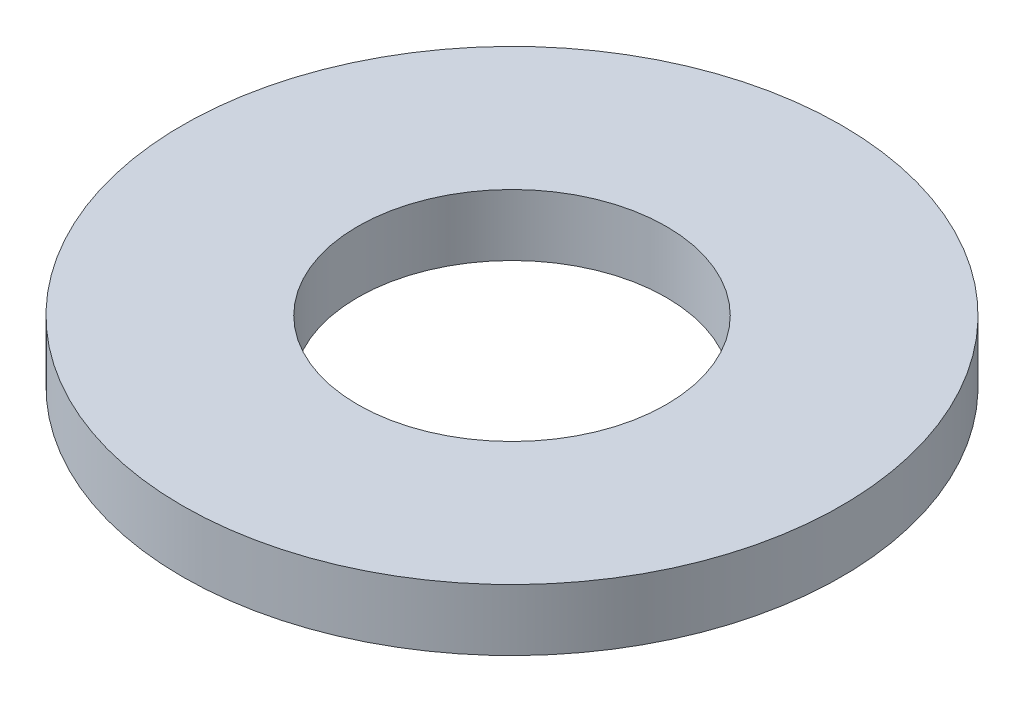
ISO-10303-21;
HEADER;
FILE_DESCRIPTION(('STEP AP214'),'2;1');
FILE_NAME('part.step','',(''),(''),'','','');
FILE_SCHEMA(('AUTOMOTIVE_DESIGN { 1 0 10303 214 1 1 1 1 }'));
ENDSEC;
DATA;
#1=APPLICATION_CONTEXT('core data for automotive mechanical design processes');
#2=APPLICATION_PROTOCOL_DEFINITION('international standard','automotive_design',2000,#1);
#3=PRODUCT_CONTEXT('',#1,'mechanical');
#4=PRODUCT('Part','Part','',(#3));
#5=PRODUCT_RELATED_PRODUCT_CATEGORY('part','',(#4));
#6=PRODUCT_DEFINITION_FORMATION('','',#4);
#7=PRODUCT_DEFINITION_CONTEXT('part definition',#1,'design');
#8=PRODUCT_DEFINITION('design','',#6,#7);
#9=PRODUCT_DEFINITION_SHAPE('','',#8);
#10=(LENGTH_UNIT() NAMED_UNIT(*) SI_UNIT(.MILLI.,.METRE.));
#11=(NAMED_UNIT(*) PLANE_ANGLE_UNIT() SI_UNIT($,.RADIAN.));
#12=(NAMED_UNIT(*) SI_UNIT($,.STERADIAN.) SOLID_ANGLE_UNIT());
#13=UNCERTAINTY_MEASURE_WITH_UNIT(LENGTH_MEASURE(1.E-05),#10,'distance_accuracy_value','');
#14=(GEOMETRIC_REPRESENTATION_CONTEXT(3) GLOBAL_UNCERTAINTY_ASSIGNED_CONTEXT((#13)) GLOBAL_UNIT_ASSIGNED_CONTEXT((#10,
#11,#12)) REPRESENTATION_CONTEXT('',''));
#15=CARTESIAN_POINT('',(0.,0.,0.));
#16=DIRECTION('',(0.,0.,1.));
#17=DIRECTION('',(1.,0.,0.));
#18=AXIS2_PLACEMENT_3D('',#15,#16,#17);
#19=CARTESIAN_POINT('',(0.,1.4224,0.));
#20=DIRECTION('',(0.,1.,0.));
#21=DIRECTION('',(0.,0.,1.));
#22=AXIS2_PLACEMENT_3D('',#19,#20,#21);
#23=PLANE('',#22);
#24=CARTESIAN_POINT('',(0.,1.4224,0.));
#25=DIRECTION('',(0.,1.,0.));
#26=DIRECTION('',(0.,0.,1.));
#27=AXIS2_PLACEMENT_3D('',#24,#25,#26);
#28=CIRCLE('',#27,7.62);
#29=CARTESIAN_POINT('',(0.,1.4224,7.62));
#30=VERTEX_POINT('',#29);
#31=EDGE_CURVE('E10',#30,#30,#28,.T.);
#32=ORIENTED_EDGE('',*,*,#31,.T.);
#33=EDGE_LOOP('',(#32));
#34=FACE_BOUND('',#33,.T.);
#35=CARTESIAN_POINT('',(0.,1.4224,0.));
#36=DIRECTION('',(0.,1.,0.));
#37=DIRECTION('',(0.,0.,1.));
#38=AXIS2_PLACEMENT_3D('',#35,#36,#37);
#39=CIRCLE('',#38,3.5687);
#40=CARTESIAN_POINT('',(0.,1.4224,3.5687));
#41=VERTEX_POINT('',#40);
#42=EDGE_CURVE('E42',#41,#41,#39,.T.);
#43=ORIENTED_EDGE('',*,*,#42,.F.);
#44=EDGE_LOOP('',(#43));
#45=FACE_BOUND('',#44,.T.);
#46=ADVANCED_FACE('F31',(#34,#45),#23,.T.);
#47=CARTESIAN_POINT('',(0.,0.,0.));
#48=DIRECTION('',(0.,1.,0.));
#49=DIRECTION('',(0.,0.,1.));
#50=AXIS2_PLACEMENT_3D('',#47,#48,#49);
#51=PLANE('',#50);
#52=CARTESIAN_POINT('',(0.,0.,0.));
#53=DIRECTION('',(0.,1.,0.));
#54=DIRECTION('',(0.,0.,1.));
#55=AXIS2_PLACEMENT_3D('',#52,#53,#54);
#56=CIRCLE('',#55,7.62);
#57=CARTESIAN_POINT('',(0.,0.,7.62));
#58=VERTEX_POINT('',#57);
#59=EDGE_CURVE('E35',#58,#58,#56,.T.);
#60=ORIENTED_EDGE('',*,*,#59,.F.);
#61=EDGE_LOOP('',(#60));
#62=FACE_BOUND('',#61,.T.);
#63=CARTESIAN_POINT('',(0.,0.,0.));
#64=DIRECTION('',(0.,1.,0.));
#65=DIRECTION('',(0.,0.,1.));
#66=AXIS2_PLACEMENT_3D('',#63,#64,#65);
#67=CIRCLE('',#66,3.5687);
#68=CARTESIAN_POINT('',(0.,0.,3.5687));
#69=VERTEX_POINT('',#68);
#70=EDGE_CURVE('E44',#69,#69,#67,.T.);
#71=ORIENTED_EDGE('',*,*,#70,.T.);
#72=EDGE_LOOP('',(#71));
#73=FACE_BOUND('',#72,.T.);
#74=ADVANCED_FACE('F54',(#62,#73),#51,.F.);
#75=CARTESIAN_POINT('',(0.,1.4224,0.));
#76=DIRECTION('',(0.,-1.,0.));
#77=DIRECTION('',(0.,0.,-1.));
#78=AXIS2_PLACEMENT_3D('',#75,#76,#77);
#79=CYLINDRICAL_SURFACE('',#78,7.62);
#80=ORIENTED_EDGE('',*,*,#31,.F.);
#81=EDGE_LOOP('',(#80));
#82=FACE_BOUND('',#81,.T.);
#83=ORIENTED_EDGE('',*,*,#59,.T.);
#84=EDGE_LOOP('',(#83));
#85=FACE_BOUND('',#84,.T.);
#86=ADVANCED_FACE('F33',(#82,#85),#79,.T.);
#87=CARTESIAN_POINT('',(0.,1.4224,0.));
#88=DIRECTION('',(0.,-1.,0.));
#89=DIRECTION('',(0.,0.,-1.));
#90=AXIS2_PLACEMENT_3D('',#87,#88,#89);
#91=CYLINDRICAL_SURFACE('',#90,3.5687);
#92=ORIENTED_EDGE('',*,*,#42,.T.);
#93=EDGE_LOOP('',(#92));
#94=FACE_BOUND('',#93,.T.);
#95=ORIENTED_EDGE('',*,*,#70,.F.);
#96=EDGE_LOOP('',(#95));
#97=FACE_BOUND('',#96,.T.);
#98=ADVANCED_FACE('F50',(#94,#97),#91,.F.);
#99=CLOSED_SHELL('',(#46,#74,#86,#98));
#100=MANIFOLD_SOLID_BREP('B2',#99);
#101=ADVANCED_BREP_SHAPE_REPRESENTATION('',(#18,#100),#14);
#102=SHAPE_DEFINITION_REPRESENTATION(#9,#101);
ENDSEC;
END-ISO-10303-21;
